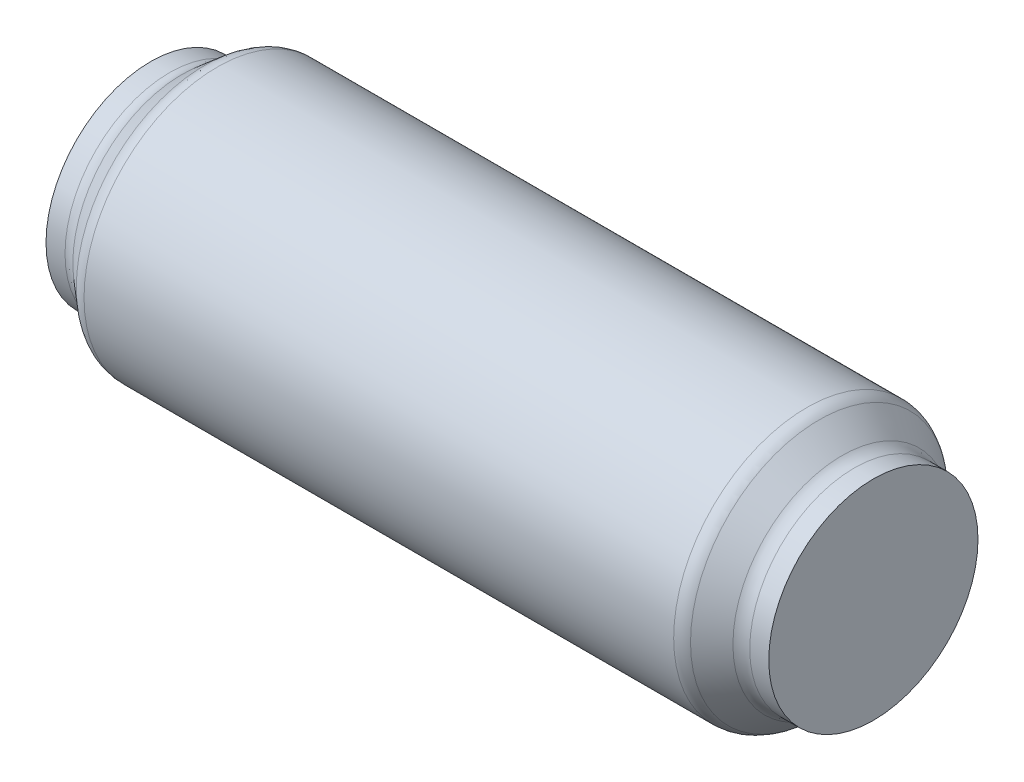
ISO-10303-21;
HEADER;
FILE_DESCRIPTION(('STEP AP214'),'2;1');
FILE_NAME('part.step','',(''),(''),'','','');
FILE_SCHEMA(('AUTOMOTIVE_DESIGN { 1 0 10303 214 1 1 1 1 }'));
ENDSEC;
DATA;
#1=APPLICATION_CONTEXT('core data for automotive mechanical design processes');
#2=APPLICATION_PROTOCOL_DEFINITION('international standard','automotive_design',2000,#1);
#3=PRODUCT_CONTEXT('',#1,'mechanical');
#4=PRODUCT('Part','Part','',(#3));
#5=PRODUCT_RELATED_PRODUCT_CATEGORY('part','',(#4));
#6=PRODUCT_DEFINITION_FORMATION('','',#4);
#7=PRODUCT_DEFINITION_CONTEXT('part definition',#1,'design');
#8=PRODUCT_DEFINITION('design','',#6,#7);
#9=PRODUCT_DEFINITION_SHAPE('','',#8);
#10=(LENGTH_UNIT() NAMED_UNIT(*) SI_UNIT(.MILLI.,.METRE.));
#11=(NAMED_UNIT(*) PLANE_ANGLE_UNIT() SI_UNIT($,.RADIAN.));
#12=(NAMED_UNIT(*) SI_UNIT($,.STERADIAN.) SOLID_ANGLE_UNIT());
#13=UNCERTAINTY_MEASURE_WITH_UNIT(LENGTH_MEASURE(1.E-05),#10,'distance_accuracy_value','');
#14=(GEOMETRIC_REPRESENTATION_CONTEXT(3) GLOBAL_UNCERTAINTY_ASSIGNED_CONTEXT((#13)) GLOBAL_UNIT_ASSIGNED_CONTEXT((#10,
#11,#12)) REPRESENTATION_CONTEXT('',''));
#15=CARTESIAN_POINT('',(0.,0.,0.));
#16=DIRECTION('',(0.,0.,1.));
#17=DIRECTION('',(1.,0.,0.));
#18=AXIS2_PLACEMENT_3D('',#15,#16,#17);
#19=CARTESIAN_POINT('',(-95.,0.,0.));
#20=DIRECTION('',(1.,0.,0.));
#21=DIRECTION('',(0.,0.,-1.));
#22=AXIS2_PLACEMENT_3D('',#19,#20,#21);
#23=PLANE('',#22);
#24=CARTESIAN_POINT('',(-95.,0.,0.));
#25=DIRECTION('',(-1.,0.,0.));
#26=DIRECTION('',(0.,0.,1.));
#27=AXIS2_PLACEMENT_3D('',#24,#25,#26);
#28=CIRCLE('',#27,27.5);
#29=CARTESIAN_POINT('',(-95.,0.,27.5));
#30=VERTEX_POINT('',#29);
#31=EDGE_CURVE('E10',#30,#30,#28,.T.);
#32=ORIENTED_EDGE('',*,*,#31,.T.);
#33=EDGE_LOOP('',(#32));
#34=FACE_BOUND('',#33,.T.);
#35=ADVANCED_FACE('F39',(#34),#23,.F.);
#36=CARTESIAN_POINT('',(-95.,0.,0.));
#37=DIRECTION('',(-1.,0.,0.));
#38=DIRECTION('',(0.,0.,1.));
#39=AXIS2_PLACEMENT_3D('',#36,#37,#38);
#40=CYLINDRICAL_SURFACE('',#39,27.5);
#41=ORIENTED_EDGE('',*,*,#31,.F.);
#42=EDGE_LOOP('',(#41));
#43=FACE_BOUND('',#42,.T.);
#44=CARTESIAN_POINT('',(-90.,0.,0.));
#45=DIRECTION('',(-1.,0.,0.));
#46=DIRECTION('',(0.,0.,1.));
#47=AXIS2_PLACEMENT_3D('',#44,#45,#46);
#48=CIRCLE('',#47,27.5);
#49=CARTESIAN_POINT('',(-90.,0.,27.5));
#50=VERTEX_POINT('',#49);
#51=EDGE_CURVE('E45',#50,#50,#48,.T.);
#52=ORIENTED_EDGE('',*,*,#51,.T.);
#53=EDGE_LOOP('',(#52));
#54=FACE_BOUND('',#53,.T.);
#55=ADVANCED_FACE('F89',(#43,#54),#40,.T.);
#56=CARTESIAN_POINT('',(-90.,0.,0.));
#57=DIRECTION('',(-1.,0.,0.));
#58=DIRECTION('',(0.,0.,1.));
#59=AXIS2_PLACEMENT_3D('',#56,#57,#58);
#60=TOROIDAL_SURFACE('',#59,32.5,4.99999999999999);
#61=ORIENTED_EDGE('',*,*,#51,.F.);
#62=EDGE_LOOP('',(#61));
#63=FACE_BOUND('',#62,.T.);
#64=CARTESIAN_POINT('',(-86.7619764731093,0.,0.));
#65=DIRECTION('',(-1.,0.,0.));
#66=DIRECTION('',(0.,0.,1.));
#67=AXIS2_PLACEMENT_3D('',#64,#65,#66);
#68=CIRCLE('',#67,28.6901176344535);
#69=CARTESIAN_POINT('',(-86.7619764731093,0.,28.6901176344535));
#70=VERTEX_POINT('',#69);
#71=EDGE_CURVE('E49',#70,#70,#68,.T.);
#72=ORIENTED_EDGE('',*,*,#71,.T.);
#73=EDGE_LOOP('',(#72));
#74=FACE_BOUND('',#73,.T.);
#75=ADVANCED_FACE('F93',(#63,#74),#60,.F.);
#76=CARTESIAN_POINT('',(-80.7380235268907,0.,0.));
#77=DIRECTION('',(1.,0.,0.));
#78=DIRECTION('',(0.,0.,-1.));
#79=AXIS2_PLACEMENT_3D('',#76,#77,#78);
#80=CONICAL_SURFACE('',#79,33.8098823655465,0.704436692676606);
#81=ORIENTED_EDGE('',*,*,#71,.F.);
#82=EDGE_LOOP('',(#81));
#83=FACE_BOUND('',#82,.T.);
#84=CARTESIAN_POINT('',(-80.7380235268907,0.,0.));
#85=DIRECTION('',(-1.,0.,0.));
#86=DIRECTION('',(0.,0.,1.));
#87=AXIS2_PLACEMENT_3D('',#84,#85,#86);
#88=CIRCLE('',#87,33.8098823655465);
#89=CARTESIAN_POINT('',(-80.7380235268907,0.,33.8098823655465));
#90=VERTEX_POINT('',#89);
#91=EDGE_CURVE('E53',#90,#90,#88,.T.);
#92=ORIENTED_EDGE('',*,*,#91,.T.);
#93=EDGE_LOOP('',(#92));
#94=FACE_BOUND('',#93,.T.);
#95=ADVANCED_FACE('F98',(#83,#94),#80,.T.);
#96=CARTESIAN_POINT('',(-77.5,0.,0.));
#97=DIRECTION('',(-1.,0.,0.));
#98=DIRECTION('',(0.,0.,1.));
#99=AXIS2_PLACEMENT_3D('',#96,#97,#98);
#100=TOROIDAL_SURFACE('',#99,30.,4.99999999999999);
#101=ORIENTED_EDGE('',*,*,#91,.F.);
#102=EDGE_LOOP('',(#101));
#103=FACE_BOUND('',#102,.T.);
#104=CARTESIAN_POINT('',(-77.5,0.,0.));
#105=DIRECTION('',(-1.,0.,0.));
#106=DIRECTION('',(0.,0.,1.));
#107=AXIS2_PLACEMENT_3D('',#104,#105,#106);
#108=CIRCLE('',#107,35.);
#109=CARTESIAN_POINT('',(-77.5,0.,35.));
#110=VERTEX_POINT('',#109);
#111=EDGE_CURVE('E58',#110,#110,#108,.T.);
#112=ORIENTED_EDGE('',*,*,#111,.T.);
#113=EDGE_LOOP('',(#112));
#114=FACE_BOUND('',#113,.T.);
#115=ADVANCED_FACE('F104',(#103,#114),#100,.T.);
#116=CARTESIAN_POINT('',(-95.,0.,0.));
#117=DIRECTION('',(-1.,0.,0.));
#118=DIRECTION('',(0.,0.,1.));
#119=AXIS2_PLACEMENT_3D('',#116,#117,#118);
#120=CYLINDRICAL_SURFACE('',#119,35.);
#121=ORIENTED_EDGE('',*,*,#111,.F.);
#122=EDGE_LOOP('',(#121));
#123=FACE_BOUND('',#122,.T.);
#124=CARTESIAN_POINT('',(77.5,0.,0.));
#125=DIRECTION('',(-1.,0.,0.));
#126=DIRECTION('',(0.,0.,1.));
#127=AXIS2_PLACEMENT_3D('',#124,#125,#126);
#128=CIRCLE('',#127,35.);
#129=CARTESIAN_POINT('',(77.5,0.,35.));
#130=VERTEX_POINT('',#129);
#131=EDGE_CURVE('E61',#130,#130,#128,.T.);
#132=ORIENTED_EDGE('',*,*,#131,.T.);
#133=EDGE_LOOP('',(#132));
#134=FACE_BOUND('',#133,.T.);
#135=ADVANCED_FACE('F108',(#123,#134),#120,.T.);
#136=CARTESIAN_POINT('',(77.5,0.,0.));
#137=DIRECTION('',(-1.,0.,0.));
#138=DIRECTION('',(0.,0.,1.));
#139=AXIS2_PLACEMENT_3D('',#136,#137,#138);
#140=TOROIDAL_SURFACE('',#139,30.,4.99999999999999);
#141=ORIENTED_EDGE('',*,*,#131,.F.);
#142=EDGE_LOOP('',(#141));
#143=FACE_BOUND('',#142,.T.);
#144=CARTESIAN_POINT('',(80.7380235268907,0.,0.));
#145=DIRECTION('',(-1.,0.,0.));
#146=DIRECTION('',(0.,0.,1.));
#147=AXIS2_PLACEMENT_3D('',#144,#145,#146);
#148=CIRCLE('',#147,33.8098823655465);
#149=CARTESIAN_POINT('',(80.7380235268907,0.,33.8098823655465));
#150=VERTEX_POINT('',#149);
#151=EDGE_CURVE('E64',#150,#150,#148,.T.);
#152=ORIENTED_EDGE('',*,*,#151,.T.);
#153=EDGE_LOOP('',(#152));
#154=FACE_BOUND('',#153,.T.);
#155=ADVANCED_FACE('F112',(#143,#154),#140,.T.);
#156=CARTESIAN_POINT('',(86.7619764731093,0.,0.));
#157=DIRECTION('',(-1.,0.,0.));
#158=DIRECTION('',(0.,0.,1.));
#159=AXIS2_PLACEMENT_3D('',#156,#157,#158);
#160=CONICAL_SURFACE('',#159,28.6901176344535,0.704436692676606);
#161=ORIENTED_EDGE('',*,*,#151,.F.);
#162=EDGE_LOOP('',(#161));
#163=FACE_BOUND('',#162,.T.);
#164=CARTESIAN_POINT('',(86.7619764731093,0.,0.));
#165=DIRECTION('',(-1.,0.,0.));
#166=DIRECTION('',(0.,0.,1.));
#167=AXIS2_PLACEMENT_3D('',#164,#165,#166);
#168=CIRCLE('',#167,28.6901176344535);
#169=CARTESIAN_POINT('',(86.7619764731093,0.,28.6901176344535));
#170=VERTEX_POINT('',#169);
#171=EDGE_CURVE('E67',#170,#170,#168,.T.);
#172=ORIENTED_EDGE('',*,*,#171,.T.);
#173=EDGE_LOOP('',(#172));
#174=FACE_BOUND('',#173,.T.);
#175=ADVANCED_FACE('F116',(#163,#174),#160,.T.);
#176=CARTESIAN_POINT('',(90.,0.,0.));
#177=DIRECTION('',(-1.,0.,0.));
#178=DIRECTION('',(0.,0.,1.));
#179=AXIS2_PLACEMENT_3D('',#176,#177,#178);
#180=TOROIDAL_SURFACE('',#179,32.5,4.99999999999999);
#181=ORIENTED_EDGE('',*,*,#171,.F.);
#182=EDGE_LOOP('',(#181));
#183=FACE_BOUND('',#182,.T.);
#184=CARTESIAN_POINT('',(90.,0.,0.));
#185=DIRECTION('',(-1.,0.,0.));
#186=DIRECTION('',(0.,0.,1.));
#187=AXIS2_PLACEMENT_3D('',#184,#185,#186);
#188=CIRCLE('',#187,27.5);
#189=CARTESIAN_POINT('',(90.,0.,27.5));
#190=VERTEX_POINT('',#189);
#191=EDGE_CURVE('E70',#190,#190,#188,.T.);
#192=ORIENTED_EDGE('',*,*,#191,.T.);
#193=EDGE_LOOP('',(#192));
#194=FACE_BOUND('',#193,.T.);
#195=ADVANCED_FACE('F85',(#183,#194),#180,.F.);
#196=CARTESIAN_POINT('',(-95.,0.,0.));
#197=DIRECTION('',(-1.,0.,0.));
#198=DIRECTION('',(0.,0.,1.));
#199=AXIS2_PLACEMENT_3D('',#196,#197,#198);
#200=CYLINDRICAL_SURFACE('',#199,27.5);
#201=ORIENTED_EDGE('',*,*,#191,.F.);
#202=EDGE_LOOP('',(#201));
#203=FACE_BOUND('',#202,.T.);
#204=CARTESIAN_POINT('',(95.,0.,0.));
#205=DIRECTION('',(-1.,0.,0.));
#206=DIRECTION('',(0.,0.,1.));
#207=AXIS2_PLACEMENT_3D('',#204,#205,#206);
#208=CIRCLE('',#207,27.5);
#209=CARTESIAN_POINT('',(95.,0.,27.5));
#210=VERTEX_POINT('',#209);
#211=EDGE_CURVE('E73',#210,#210,#208,.T.);
#212=ORIENTED_EDGE('',*,*,#211,.T.);
#213=EDGE_LOOP('',(#212));
#214=FACE_BOUND('',#213,.T.);
#215=ADVANCED_FACE('F77',(#203,#214),#200,.T.);
#216=CARTESIAN_POINT('',(95.,0.,0.));
#217=DIRECTION('',(-1.,0.,0.));
#218=DIRECTION('',(0.,0.,1.));
#219=AXIS2_PLACEMENT_3D('',#216,#217,#218);
#220=PLANE('',#219);
#221=ORIENTED_EDGE('',*,*,#211,.F.);
#222=EDGE_LOOP('',(#221));
#223=FACE_BOUND('',#222,.T.);
#224=ADVANCED_FACE('F79',(#223),#220,.F.);
#225=CLOSED_SHELL('',(#35,#55,#75,#95,#115,#135,#155,#175,#195,#215,#224));
#226=MANIFOLD_SOLID_BREP('B2',#225);
#227=ADVANCED_BREP_SHAPE_REPRESENTATION('',(#18,#226),#14);
#228=SHAPE_DEFINITION_REPRESENTATION(#9,#227);
ENDSEC;
END-ISO-10303-21;
